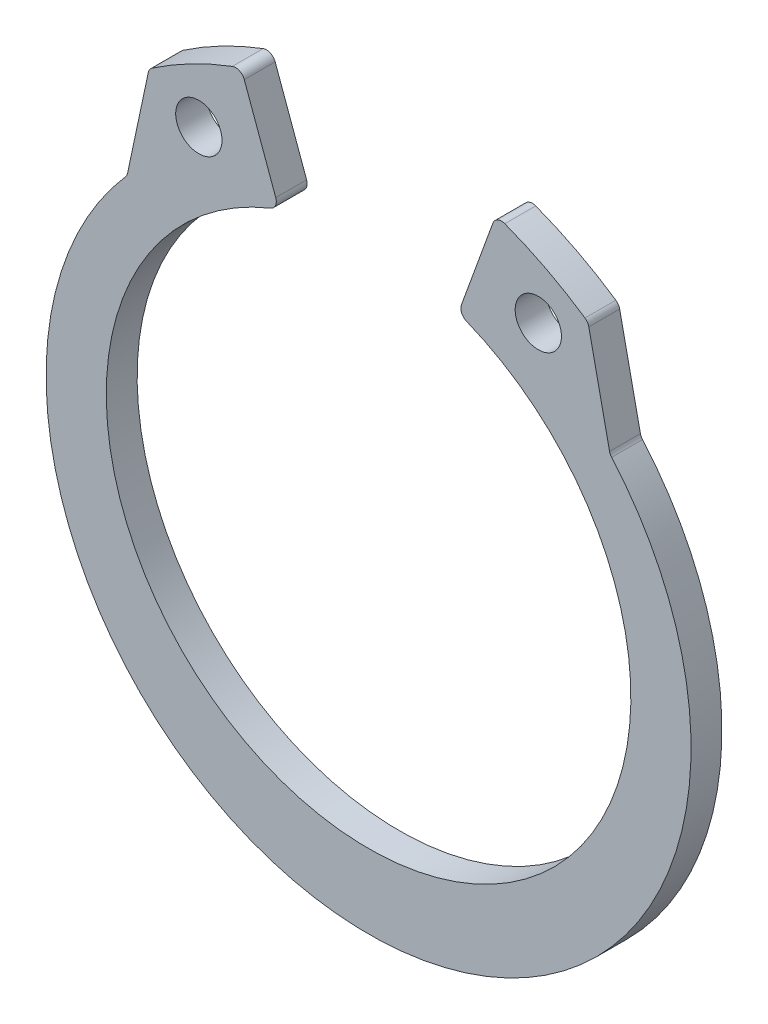
ISO-10303-21;
HEADER;
FILE_DESCRIPTION(('STEP AP214'),'2;1');
FILE_NAME('part.step','',(''),(''),'','','');
FILE_SCHEMA(('AUTOMOTIVE_DESIGN { 1 0 10303 214 1 1 1 1 }'));
ENDSEC;
DATA;
#1=APPLICATION_CONTEXT('core data for automotive mechanical design processes');
#2=APPLICATION_PROTOCOL_DEFINITION('international standard','automotive_design',2000,#1);
#3=PRODUCT_CONTEXT('',#1,'mechanical');
#4=PRODUCT('Part','Part','',(#3));
#5=PRODUCT_RELATED_PRODUCT_CATEGORY('part','',(#4));
#6=PRODUCT_DEFINITION_FORMATION('','',#4);
#7=PRODUCT_DEFINITION_CONTEXT('part definition',#1,'design');
#8=PRODUCT_DEFINITION('design','',#6,#7);
#9=PRODUCT_DEFINITION_SHAPE('','',#8);
#10=(LENGTH_UNIT() NAMED_UNIT(*) SI_UNIT(.MILLI.,.METRE.));
#11=(NAMED_UNIT(*) PLANE_ANGLE_UNIT() SI_UNIT($,.RADIAN.));
#12=(NAMED_UNIT(*) SI_UNIT($,.STERADIAN.) SOLID_ANGLE_UNIT());
#13=UNCERTAINTY_MEASURE_WITH_UNIT(LENGTH_MEASURE(1.E-05),#10,'distance_accuracy_value','');
#14=(GEOMETRIC_REPRESENTATION_CONTEXT(3) GLOBAL_UNCERTAINTY_ASSIGNED_CONTEXT((#13)) GLOBAL_UNIT_ASSIGNED_CONTEXT((#10,
#11,#12)) REPRESENTATION_CONTEXT('',''));
#15=CARTESIAN_POINT('',(0.,0.,0.));
#16=DIRECTION('',(0.,0.,1.));
#17=DIRECTION('',(1.,0.,0.));
#18=AXIS2_PLACEMENT_3D('',#15,#16,#17);
#19=CARTESIAN_POINT('',(-4.30962714854673,10.9634619568521,1.));
#20=DIRECTION('',(0.,0.,1.));
#21=DIRECTION('',(1.,0.,0.));
#22=AXIS2_PLACEMENT_3D('',#19,#20,#21);
#23=PLANE('',#22);
#24=CARTESIAN_POINT('',(-5.5,9.,1.));
#25=DIRECTION('',(0.,0.,1.));
#26=DIRECTION('',(1.,0.,0.));
#27=AXIS2_PLACEMENT_3D('',#24,#25,#26);
#28=CIRCLE('',#27,0.750000000000001);
#29=CARTESIAN_POINT('',(-4.75,9.,1.));
#30=VERTEX_POINT('',#29);
#31=EDGE_CURVE('E482',#30,#30,#28,.T.);
#32=ORIENTED_EDGE('',*,*,#31,.F.);
#33=EDGE_LOOP('',(#32));
#34=FACE_BOUND('',#33,.T.);
#35=CARTESIAN_POINT('',(-4.30962714854673,10.9634619568521,1.));
#36=DIRECTION('',(0.,0.,1.));
#37=DIRECTION('',(1.,0.,0.));
#38=AXIS2_PLACEMENT_3D('',#35,#36,#37);
#39=CIRCLE('',#38,0.300000000000001);
#40=CARTESIAN_POINT('',(-4.02771936231096,11.0660679998497,1.));
#41=VERTEX_POINT('',#40);
#42=CARTESIAN_POINT('',(-4.41560158662575,11.2441208574304,1.));
#43=VERTEX_POINT('',#42);
#44=EDGE_CURVE('E516',#41,#43,#39,.T.);
#45=ORIENTED_EDGE('',*,*,#44,.T.);
#46=CARTESIAN_POINT('',(0.,-0.45,1.));
#47=DIRECTION('',(0.,0.,1.));
#48=DIRECTION('',(1.,0.,0.));
#49=AXIS2_PLACEMENT_3D('',#46,#47,#48);
#50=CIRCLE('',#49,12.5);
#51=CARTESIAN_POINT('',(-7.01270309923166,9.89755986897523,1.));
#52=VERTEX_POINT('',#51);
#53=EDGE_CURVE('E477',#43,#52,#50,.T.);
#54=ORIENTED_EDGE('',*,*,#53,.T.);
#55=CARTESIAN_POINT('',(-6.8443982248501,9.64921843211983,1.));
#56=DIRECTION('',(0.,0.,1.));
#57=DIRECTION('',(1.,0.,0.));
#58=AXIS2_PLACEMENT_3D('',#55,#56,#57);
#59=CIRCLE('',#58,0.299999999999999);
#60=CARTESIAN_POINT('',(-7.13784250507024,9.71159193936516,1.));
#61=VERTEX_POINT('',#60);
#62=EDGE_CURVE('E519',#52,#61,#59,.T.);
#63=ORIENTED_EDGE('',*,*,#62,.T.);
#64=DIRECTION('',(-0.207911690817759,-0.978147600733806,0.));
#65=VECTOR('',#64,1.);
#66=CARTESIAN_POINT('',(-7.80942490766801,6.55204514710783,1.));
#67=LINE('',#66,#65);
#68=CARTESIAN_POINT('',(-7.80942490766801,6.55204514710783,1.));
#69=VERTEX_POINT('',#68);
#70=EDGE_CURVE('E521',#61,#69,#67,.T.);
#71=ORIENTED_EDGE('',*,*,#70,.T.);
#72=CARTESIAN_POINT('',(-8.10286918788815,6.61441865435316,1.));
#73=DIRECTION('',(0.,0.,-1.));
#74=DIRECTION('',(-1.,0.,0.));
#75=AXIS2_PLACEMENT_3D('',#72,#73,#74);
#76=CIRCLE('',#75,0.3);
#77=CARTESIAN_POINT('',(-7.87674260590057,6.41727208725493,1.));
#78=VERTEX_POINT('',#77);
#79=EDGE_CURVE('E523',#69,#78,#76,.T.);
#80=ORIENTED_EDGE('',*,*,#79,.T.);
#81=CARTESIAN_POINT('',(0.,-0.45,1.));
#82=DIRECTION('',(0.,0.,1.));
#83=DIRECTION('',(1.,0.,0.));
#84=AXIS2_PLACEMENT_3D('',#81,#82,#83);
#85=CIRCLE('',#84,10.45);
#86=CARTESIAN_POINT('',(7.87674260590057,6.41727208725493,1.));
#87=VERTEX_POINT('',#86);
#88=EDGE_CURVE('E525',#78,#87,#85,.T.);
#89=ORIENTED_EDGE('',*,*,#88,.T.);
#90=CARTESIAN_POINT('',(8.10286918788815,6.61441865435316,1.));
#91=DIRECTION('',(0.,0.,-1.));
#92=DIRECTION('',(1.,0.,0.));
#93=AXIS2_PLACEMENT_3D('',#90,#91,#92);
#94=CIRCLE('',#93,0.3);
#95=CARTESIAN_POINT('',(7.80942490766801,6.55204514710783,1.));
#96=VERTEX_POINT('',#95);
#97=EDGE_CURVE('E527',#87,#96,#94,.T.);
#98=ORIENTED_EDGE('',*,*,#97,.T.);
#99=DIRECTION('',(-0.207911690817759,0.978147600733806,0.));
#100=VECTOR('',#99,1.);
#101=CARTESIAN_POINT('',(7.80942490766801,6.55204514710783,1.));
#102=LINE('',#101,#100);
#103=CARTESIAN_POINT('',(7.13784250507024,9.71159193936516,1.));
#104=VERTEX_POINT('',#103);
#105=EDGE_CURVE('E529',#96,#104,#102,.T.);
#106=ORIENTED_EDGE('',*,*,#105,.T.);
#107=CARTESIAN_POINT('',(6.8443982248501,9.64921843211983,1.));
#108=DIRECTION('',(0.,0.,1.));
#109=DIRECTION('',(-1.,0.,0.));
#110=AXIS2_PLACEMENT_3D('',#107,#108,#109);
#111=CIRCLE('',#110,0.299999999999999);
#112=CARTESIAN_POINT('',(7.01270309923166,9.89755986897523,1.));
#113=VERTEX_POINT('',#112);
#114=EDGE_CURVE('E531',#104,#113,#111,.T.);
#115=ORIENTED_EDGE('',*,*,#114,.T.);
#116=CARTESIAN_POINT('',(0.,-0.45,1.));
#117=DIRECTION('',(0.,0.,1.));
#118=DIRECTION('',(-1.,0.,0.));
#119=AXIS2_PLACEMENT_3D('',#116,#117,#118);
#120=CIRCLE('',#119,12.5);
#121=CARTESIAN_POINT('',(4.41560158662575,11.2441208574304,1.));
#122=VERTEX_POINT('',#121);
#123=EDGE_CURVE('E533',#113,#122,#120,.T.);
#124=ORIENTED_EDGE('',*,*,#123,.T.);
#125=CARTESIAN_POINT('',(4.30962714854673,10.9634619568521,1.));
#126=DIRECTION('',(0.,0.,1.));
#127=DIRECTION('',(-1.,0.,0.));
#128=AXIS2_PLACEMENT_3D('',#125,#126,#127);
#129=CIRCLE('',#128,0.300000000000001);
#130=CARTESIAN_POINT('',(4.02771936231096,11.0660679998497,1.));
#131=VERTEX_POINT('',#130);
#132=EDGE_CURVE('E535',#122,#131,#129,.T.);
#133=ORIENTED_EDGE('',*,*,#132,.T.);
#134=DIRECTION('',(-0.34202014332566,-0.939692620785911,0.));
#135=VECTOR('',#134,1.);
#136=CARTESIAN_POINT('',(4.02771936231096,11.0660679998497,1.));
#137=LINE('',#136,#135);
#138=CARTESIAN_POINT('',(3.00802778617041,8.26448841959542,1.));
#139=VERTEX_POINT('',#138);
#140=EDGE_CURVE('E537',#131,#139,#137,.T.);
#141=ORIENTED_EDGE('',*,*,#140,.T.);
#142=CARTESIAN_POINT('',(3.28993557240618,8.16188237659772,1.));
#143=DIRECTION('',(0.,0.,1.));
#144=DIRECTION('',(1.,0.,0.));
#145=AXIS2_PLACEMENT_3D('',#142,#143,#144);
#146=CIRCLE('',#145,0.3);
#147=CARTESIAN_POINT('',(3.17777867789233,7.88363638648643,1.));
#148=VERTEX_POINT('',#147);
#149=EDGE_CURVE('E539',#139,#148,#146,.T.);
#150=ORIENTED_EDGE('',*,*,#149,.T.);
#151=CARTESIAN_POINT('',(0.,0.,1.));
#152=DIRECTION('',(0.,0.,-1.));
#153=DIRECTION('',(1.,0.,0.));
#154=AXIS2_PLACEMENT_3D('',#151,#152,#153);
#155=CIRCLE('',#154,8.5);
#156=CARTESIAN_POINT('',(-3.17777867789233,7.88363638648643,1.));
#157=VERTEX_POINT('',#156);
#158=EDGE_CURVE('E541',#148,#157,#155,.T.);
#159=ORIENTED_EDGE('',*,*,#158,.T.);
#160=CARTESIAN_POINT('',(-3.28993557240618,8.16188237659772,1.));
#161=DIRECTION('',(0.,0.,1.));
#162=DIRECTION('',(-1.,0.,0.));
#163=AXIS2_PLACEMENT_3D('',#160,#161,#162);
#164=CIRCLE('',#163,0.300000000000003);
#165=CARTESIAN_POINT('',(-3.0080277861704,8.26448841959542,1.));
#166=VERTEX_POINT('',#165);
#167=EDGE_CURVE('E370',#157,#166,#164,.T.);
#168=ORIENTED_EDGE('',*,*,#167,.T.);
#169=DIRECTION('',(-0.342020143325662,0.939692620785911,0.));
#170=VECTOR('',#169,1.);
#171=CARTESIAN_POINT('',(-4.02771936231096,11.0660679998497,1.));
#172=LINE('',#171,#170);
#173=EDGE_CURVE('E365',#166,#41,#172,.T.);
#174=ORIENTED_EDGE('',*,*,#173,.T.);
#175=EDGE_LOOP('',(#45,#54,#63,#71,#80,#89,#98,#106,#115,#124,#133,#141,#150,#159,#168,#174));
#176=FACE_BOUND('',#175,.T.);
#177=CARTESIAN_POINT('',(5.5,9.,1.));
#178=DIRECTION('',(0.,0.,1.));
#179=DIRECTION('',(-1.,0.,0.));
#180=AXIS2_PLACEMENT_3D('',#177,#178,#179);
#181=CIRCLE('',#180,0.750000000000001);
#182=CARTESIAN_POINT('',(4.75,9.,1.));
#183=VERTEX_POINT('',#182);
#184=EDGE_CURVE('E676',#183,#183,#181,.T.);
#185=ORIENTED_EDGE('',*,*,#184,.F.);
#186=EDGE_LOOP('',(#185));
#187=FACE_BOUND('',#186,.T.);
#188=ADVANCED_FACE('F350',(#34,#176,#187),#23,.T.);
#189=CARTESIAN_POINT('',(-4.30962714854673,10.9634619568521,0.));
#190=DIRECTION('',(0.,0.,1.));
#191=DIRECTION('',(1.,0.,0.));
#192=AXIS2_PLACEMENT_3D('',#189,#190,#191);
#193=PLANE('',#192);
#194=CARTESIAN_POINT('',(-5.5,9.,0.));
#195=DIRECTION('',(0.,0.,1.));
#196=DIRECTION('',(1.,0.,0.));
#197=AXIS2_PLACEMENT_3D('',#194,#195,#196);
#198=CIRCLE('',#197,0.750000000000001);
#199=CARTESIAN_POINT('',(-4.75,9.,0.));
#200=VERTEX_POINT('',#199);
#201=EDGE_CURVE('E485',#200,#200,#198,.T.);
#202=ORIENTED_EDGE('',*,*,#201,.T.);
#203=EDGE_LOOP('',(#202));
#204=FACE_BOUND('',#203,.T.);
#205=CARTESIAN_POINT('',(-4.30962714854673,10.9634619568521,0.));
#206=DIRECTION('',(0.,0.,1.));
#207=DIRECTION('',(1.,0.,0.));
#208=AXIS2_PLACEMENT_3D('',#205,#206,#207);
#209=CIRCLE('',#208,0.300000000000001);
#210=CARTESIAN_POINT('',(-4.02771936231096,11.0660679998497,0.));
#211=VERTEX_POINT('',#210);
#212=CARTESIAN_POINT('',(-4.41560158662575,11.2441208574304,0.));
#213=VERTEX_POINT('',#212);
#214=EDGE_CURVE('E468',#211,#213,#209,.T.);
#215=ORIENTED_EDGE('',*,*,#214,.F.);
#216=DIRECTION('',(-0.342020143325662,0.939692620785911,0.));
#217=VECTOR('',#216,1.);
#218=CARTESIAN_POINT('',(-4.02771936231096,11.0660679998497,0.));
#219=LINE('',#218,#217);
#220=CARTESIAN_POINT('',(-3.0080277861704,8.26448841959542,0.));
#221=VERTEX_POINT('',#220);
#222=EDGE_CURVE('E514',#221,#211,#219,.T.);
#223=ORIENTED_EDGE('',*,*,#222,.F.);
#224=CARTESIAN_POINT('',(-3.28993557240618,8.16188237659772,0.));
#225=DIRECTION('',(0.,0.,1.));
#226=DIRECTION('',(-1.,0.,0.));
#227=AXIS2_PLACEMENT_3D('',#224,#225,#226);
#228=CIRCLE('',#227,0.300000000000003);
#229=CARTESIAN_POINT('',(-3.17777867789233,7.88363638648643,0.));
#230=VERTEX_POINT('',#229);
#231=EDGE_CURVE('E512',#230,#221,#228,.T.);
#232=ORIENTED_EDGE('',*,*,#231,.F.);
#233=CARTESIAN_POINT('',(0.,0.,0.));
#234=DIRECTION('',(0.,0.,-1.));
#235=DIRECTION('',(1.,0.,0.));
#236=AXIS2_PLACEMENT_3D('',#233,#234,#235);
#237=CIRCLE('',#236,8.5);
#238=CARTESIAN_POINT('',(3.17777867789233,7.88363638648643,0.));
#239=VERTEX_POINT('',#238);
#240=EDGE_CURVE('E510',#239,#230,#237,.T.);
#241=ORIENTED_EDGE('',*,*,#240,.F.);
#242=CARTESIAN_POINT('',(3.28993557240618,8.16188237659772,0.));
#243=DIRECTION('',(0.,0.,1.));
#244=DIRECTION('',(1.,0.,0.));
#245=AXIS2_PLACEMENT_3D('',#242,#243,#244);
#246=CIRCLE('',#245,0.3);
#247=CARTESIAN_POINT('',(3.00802778617041,8.26448841959542,0.));
#248=VERTEX_POINT('',#247);
#249=EDGE_CURVE('E508',#248,#239,#246,.T.);
#250=ORIENTED_EDGE('',*,*,#249,.F.);
#251=DIRECTION('',(-0.34202014332566,-0.939692620785911,0.));
#252=VECTOR('',#251,1.);
#253=CARTESIAN_POINT('',(4.02771936231096,11.0660679998497,0.));
#254=LINE('',#253,#252);
#255=CARTESIAN_POINT('',(4.02771936231096,11.0660679998497,0.));
#256=VERTEX_POINT('',#255);
#257=EDGE_CURVE('E506',#256,#248,#254,.T.);
#258=ORIENTED_EDGE('',*,*,#257,.F.);
#259=CARTESIAN_POINT('',(4.30962714854673,10.9634619568521,0.));
#260=DIRECTION('',(0.,0.,1.));
#261=DIRECTION('',(-1.,0.,0.));
#262=AXIS2_PLACEMENT_3D('',#259,#260,#261);
#263=CIRCLE('',#262,0.300000000000001);
#264=CARTESIAN_POINT('',(4.41560158662575,11.2441208574304,0.));
#265=VERTEX_POINT('',#264);
#266=EDGE_CURVE('E504',#265,#256,#263,.T.);
#267=ORIENTED_EDGE('',*,*,#266,.F.);
#268=CARTESIAN_POINT('',(0.,-0.45,0.));
#269=DIRECTION('',(0.,0.,1.));
#270=DIRECTION('',(-1.,0.,0.));
#271=AXIS2_PLACEMENT_3D('',#268,#269,#270);
#272=CIRCLE('',#271,12.5);
#273=CARTESIAN_POINT('',(7.01270309923166,9.89755986897523,0.));
#274=VERTEX_POINT('',#273);
#275=EDGE_CURVE('E502',#274,#265,#272,.T.);
#276=ORIENTED_EDGE('',*,*,#275,.F.);
#277=CARTESIAN_POINT('',(6.8443982248501,9.64921843211983,0.));
#278=DIRECTION('',(0.,0.,1.));
#279=DIRECTION('',(-1.,0.,0.));
#280=AXIS2_PLACEMENT_3D('',#277,#278,#279);
#281=CIRCLE('',#280,0.299999999999999);
#282=CARTESIAN_POINT('',(7.13784250507024,9.71159193936516,0.));
#283=VERTEX_POINT('',#282);
#284=EDGE_CURVE('E500',#283,#274,#281,.T.);
#285=ORIENTED_EDGE('',*,*,#284,.F.);
#286=DIRECTION('',(-0.207911690817759,0.978147600733806,0.));
#287=VECTOR('',#286,1.);
#288=CARTESIAN_POINT('',(7.80942490766801,6.55204514710783,0.));
#289=LINE('',#288,#287);
#290=CARTESIAN_POINT('',(7.80942490766801,6.55204514710783,0.));
#291=VERTEX_POINT('',#290);
#292=EDGE_CURVE('E498',#291,#283,#289,.T.);
#293=ORIENTED_EDGE('',*,*,#292,.F.);
#294=CARTESIAN_POINT('',(8.10286918788815,6.61441865435316,0.));
#295=DIRECTION('',(0.,0.,-1.));
#296=DIRECTION('',(1.,0.,0.));
#297=AXIS2_PLACEMENT_3D('',#294,#295,#296);
#298=CIRCLE('',#297,0.3);
#299=CARTESIAN_POINT('',(7.87674260590057,6.41727208725493,0.));
#300=VERTEX_POINT('',#299);
#301=EDGE_CURVE('E496',#300,#291,#298,.T.);
#302=ORIENTED_EDGE('',*,*,#301,.F.);
#303=CARTESIAN_POINT('',(0.,-0.45,0.));
#304=DIRECTION('',(0.,0.,1.));
#305=DIRECTION('',(1.,0.,0.));
#306=AXIS2_PLACEMENT_3D('',#303,#304,#305);
#307=CIRCLE('',#306,10.45);
#308=CARTESIAN_POINT('',(-7.87674260590057,6.41727208725493,0.));
#309=VERTEX_POINT('',#308);
#310=EDGE_CURVE('E494',#309,#300,#307,.T.);
#311=ORIENTED_EDGE('',*,*,#310,.F.);
#312=CARTESIAN_POINT('',(-8.10286918788815,6.61441865435316,0.));
#313=DIRECTION('',(0.,0.,-1.));
#314=DIRECTION('',(-1.,0.,0.));
#315=AXIS2_PLACEMENT_3D('',#312,#313,#314);
#316=CIRCLE('',#315,0.3);
#317=CARTESIAN_POINT('',(-7.80942490766801,6.55204514710783,0.));
#318=VERTEX_POINT('',#317);
#319=EDGE_CURVE('E492',#318,#309,#316,.T.);
#320=ORIENTED_EDGE('',*,*,#319,.F.);
#321=DIRECTION('',(-0.207911690817759,-0.978147600733806,0.));
#322=VECTOR('',#321,1.);
#323=CARTESIAN_POINT('',(-7.80942490766801,6.55204514710783,0.));
#324=LINE('',#323,#322);
#325=CARTESIAN_POINT('',(-7.13784250507024,9.71159193936516,0.));
#326=VERTEX_POINT('',#325);
#327=EDGE_CURVE('E490',#326,#318,#324,.T.);
#328=ORIENTED_EDGE('',*,*,#327,.F.);
#329=CARTESIAN_POINT('',(-6.8443982248501,9.64921843211983,0.));
#330=DIRECTION('',(0.,0.,1.));
#331=DIRECTION('',(1.,0.,0.));
#332=AXIS2_PLACEMENT_3D('',#329,#330,#331);
#333=CIRCLE('',#332,0.299999999999999);
#334=CARTESIAN_POINT('',(-7.01270309923166,9.89755986897523,0.));
#335=VERTEX_POINT('',#334);
#336=EDGE_CURVE('E470',#335,#326,#333,.T.);
#337=ORIENTED_EDGE('',*,*,#336,.F.);
#338=CARTESIAN_POINT('',(0.,-0.45,0.));
#339=DIRECTION('',(0.,0.,1.));
#340=DIRECTION('',(1.,0.,0.));
#341=AXIS2_PLACEMENT_3D('',#338,#339,#340);
#342=CIRCLE('',#341,12.5);
#343=EDGE_CURVE('E463',#213,#335,#342,.T.);
#344=ORIENTED_EDGE('',*,*,#343,.F.);
#345=EDGE_LOOP('',(#215,#223,#232,#241,#250,#258,#267,#276,#285,#293,#302,#311,#320,#328,#337,#344));
#346=FACE_BOUND('',#345,.T.);
#347=CARTESIAN_POINT('',(5.5,9.,0.));
#348=DIRECTION('',(0.,0.,1.));
#349=DIRECTION('',(-1.,0.,0.));
#350=AXIS2_PLACEMENT_3D('',#347,#348,#349);
#351=CIRCLE('',#350,0.750000000000001);
#352=CARTESIAN_POINT('',(4.75,9.,0.));
#353=VERTEX_POINT('',#352);
#354=EDGE_CURVE('E679',#353,#353,#351,.T.);
#355=ORIENTED_EDGE('',*,*,#354,.T.);
#356=EDGE_LOOP('',(#355));
#357=FACE_BOUND('',#356,.T.);
#358=ADVANCED_FACE('F464',(#204,#346,#357),#193,.F.);
#359=CARTESIAN_POINT('',(-4.30962714854673,10.9634619568521,1.));
#360=DIRECTION('',(0.,0.,-1.));
#361=DIRECTION('',(-1.,0.,0.));
#362=AXIS2_PLACEMENT_3D('',#359,#360,#361);
#363=CYLINDRICAL_SURFACE('',#362,0.300000000000001);
#364=ORIENTED_EDGE('',*,*,#214,.T.);
#365=DIRECTION('',(0.,0.,-1.));
#366=VECTOR('',#365,1.);
#367=CARTESIAN_POINT('',(-4.41560158662575,11.2441208574304,1.));
#368=LINE('',#367,#366);
#369=EDGE_CURVE('E11',#43,#213,#368,.T.);
#370=ORIENTED_EDGE('',*,*,#369,.F.);
#371=ORIENTED_EDGE('',*,*,#44,.F.);
#372=DIRECTION('',(0.,0.,-1.));
#373=VECTOR('',#372,1.);
#374=CARTESIAN_POINT('',(-4.02771936231096,11.0660679998497,1.));
#375=LINE('',#374,#373);
#376=EDGE_CURVE('E481',#41,#211,#375,.T.);
#377=ORIENTED_EDGE('',*,*,#376,.T.);
#378=EDGE_LOOP('',(#364,#370,#371,#377));
#379=FACE_BOUND('',#378,.T.);
#380=ADVANCED_FACE('F352',(#379),#363,.T.);
#381=CARTESIAN_POINT('',(0.,-0.45,1.));
#382=DIRECTION('',(0.,0.,-1.));
#383=DIRECTION('',(-1.,0.,0.));
#384=AXIS2_PLACEMENT_3D('',#381,#382,#383);
#385=CYLINDRICAL_SURFACE('',#384,12.5);
#386=ORIENTED_EDGE('',*,*,#343,.T.);
#387=DIRECTION('',(0.,0.,-1.));
#388=VECTOR('',#387,1.);
#389=CARTESIAN_POINT('',(-7.01270309923166,9.89755986897523,1.));
#390=LINE('',#389,#388);
#391=EDGE_CURVE('E358',#52,#335,#390,.T.);
#392=ORIENTED_EDGE('',*,*,#391,.F.);
#393=ORIENTED_EDGE('',*,*,#53,.F.);
#394=ORIENTED_EDGE('',*,*,#369,.T.);
#395=EDGE_LOOP('',(#386,#392,#393,#394));
#396=FACE_BOUND('',#395,.T.);
#397=ADVANCED_FACE('F476',(#396),#385,.T.);
#398=CARTESIAN_POINT('',(-6.8443982248501,9.64921843211983,1.));
#399=DIRECTION('',(0.,0.,-1.));
#400=DIRECTION('',(-1.,0.,0.));
#401=AXIS2_PLACEMENT_3D('',#398,#399,#400);
#402=CYLINDRICAL_SURFACE('',#401,0.299999999999999);
#403=ORIENTED_EDGE('',*,*,#336,.T.);
#404=DIRECTION('',(0.,0.,-1.));
#405=VECTOR('',#404,1.);
#406=CARTESIAN_POINT('',(-7.13784250507024,9.71159193936516,1.));
#407=LINE('',#406,#405);
#408=EDGE_CURVE('E582',#61,#326,#407,.T.);
#409=ORIENTED_EDGE('',*,*,#408,.F.);
#410=ORIENTED_EDGE('',*,*,#62,.F.);
#411=ORIENTED_EDGE('',*,*,#391,.T.);
#412=EDGE_LOOP('',(#403,#409,#410,#411));
#413=FACE_BOUND('',#412,.T.);
#414=ADVANCED_FACE('F586',(#413),#402,.T.);
#415=CARTESIAN_POINT('',(-7.80942490766801,6.55204514710783,1.));
#416=DIRECTION('',(0.978147600733806,-0.207911690817759,0.));
#417=DIRECTION('',(0.207911690817759,0.978147600733806,0.));
#418=AXIS2_PLACEMENT_3D('',#415,#416,#417);
#419=PLANE('',#418);
#420=ORIENTED_EDGE('',*,*,#327,.T.);
#421=DIRECTION('',(0.,0.,-1.));
#422=VECTOR('',#421,1.);
#423=CARTESIAN_POINT('',(-7.80942490766801,6.55204514710783,1.));
#424=LINE('',#423,#422);
#425=EDGE_CURVE('E579',#69,#318,#424,.T.);
#426=ORIENTED_EDGE('',*,*,#425,.F.);
#427=ORIENTED_EDGE('',*,*,#70,.F.);
#428=ORIENTED_EDGE('',*,*,#408,.T.);
#429=EDGE_LOOP('',(#420,#426,#427,#428));
#430=FACE_BOUND('',#429,.T.);
#431=ADVANCED_FACE('F594',(#430),#419,.F.);
#432=CARTESIAN_POINT('',(-8.10286918788815,6.61441865435316,1.));
#433=DIRECTION('',(0.,0.,-1.));
#434=DIRECTION('',(-1.,0.,0.));
#435=AXIS2_PLACEMENT_3D('',#432,#433,#434);
#436=CYLINDRICAL_SURFACE('',#435,0.3);
#437=ORIENTED_EDGE('',*,*,#319,.T.);
#438=DIRECTION('',(0.,0.,-1.));
#439=VECTOR('',#438,1.);
#440=CARTESIAN_POINT('',(-7.87674260590057,6.41727208725493,1.));
#441=LINE('',#440,#439);
#442=EDGE_CURVE('E576',#78,#309,#441,.T.);
#443=ORIENTED_EDGE('',*,*,#442,.F.);
#444=ORIENTED_EDGE('',*,*,#79,.F.);
#445=ORIENTED_EDGE('',*,*,#425,.T.);
#446=EDGE_LOOP('',(#437,#443,#444,#445));
#447=FACE_BOUND('',#446,.T.);
#448=ADVANCED_FACE('F597',(#447),#436,.F.);
#449=CARTESIAN_POINT('',(0.,-0.45,1.));
#450=DIRECTION('',(0.,0.,-1.));
#451=DIRECTION('',(-1.,0.,0.));
#452=AXIS2_PLACEMENT_3D('',#449,#450,#451);
#453=CYLINDRICAL_SURFACE('',#452,10.45);
#454=ORIENTED_EDGE('',*,*,#310,.T.);
#455=DIRECTION('',(0.,0.,-1.));
#456=VECTOR('',#455,1.);
#457=CARTESIAN_POINT('',(7.87674260590057,6.41727208725493,1.));
#458=LINE('',#457,#456);
#459=EDGE_CURVE('E573',#87,#300,#458,.T.);
#460=ORIENTED_EDGE('',*,*,#459,.F.);
#461=ORIENTED_EDGE('',*,*,#88,.F.);
#462=ORIENTED_EDGE('',*,*,#442,.T.);
#463=EDGE_LOOP('',(#454,#460,#461,#462));
#464=FACE_BOUND('',#463,.T.);
#465=ADVANCED_FACE('F602',(#464),#453,.T.);
#466=CARTESIAN_POINT('',(8.10286918788815,6.61441865435316,1.));
#467=DIRECTION('',(0.,0.,-1.));
#468=DIRECTION('',(-1.,0.,0.));
#469=AXIS2_PLACEMENT_3D('',#466,#467,#468);
#470=CYLINDRICAL_SURFACE('',#469,0.3);
#471=ORIENTED_EDGE('',*,*,#301,.T.);
#472=DIRECTION('',(0.,0.,-1.));
#473=VECTOR('',#472,1.);
#474=CARTESIAN_POINT('',(7.80942490766801,6.55204514710783,1.));
#475=LINE('',#474,#473);
#476=EDGE_CURVE('E570',#96,#291,#475,.T.);
#477=ORIENTED_EDGE('',*,*,#476,.F.);
#478=ORIENTED_EDGE('',*,*,#97,.F.);
#479=ORIENTED_EDGE('',*,*,#459,.T.);
#480=EDGE_LOOP('',(#471,#477,#478,#479));
#481=FACE_BOUND('',#480,.T.);
#482=ADVANCED_FACE('F608',(#481),#470,.F.);
#483=CARTESIAN_POINT('',(7.80942490766801,6.55204514710783,1.));
#484=DIRECTION('',(-0.978147600733806,-0.207911690817759,0.));
#485=DIRECTION('',(0.207911690817759,-0.978147600733806,0.));
#486=AXIS2_PLACEMENT_3D('',#483,#484,#485);
#487=PLANE('',#486);
#488=ORIENTED_EDGE('',*,*,#292,.T.);
#489=DIRECTION('',(0.,0.,-1.));
#490=VECTOR('',#489,1.);
#491=CARTESIAN_POINT('',(7.13784250507024,9.71159193936516,1.));
#492=LINE('',#491,#490);
#493=EDGE_CURVE('E567',#104,#283,#492,.T.);
#494=ORIENTED_EDGE('',*,*,#493,.F.);
#495=ORIENTED_EDGE('',*,*,#105,.F.);
#496=ORIENTED_EDGE('',*,*,#476,.T.);
#497=EDGE_LOOP('',(#488,#494,#495,#496));
#498=FACE_BOUND('',#497,.T.);
#499=ADVANCED_FACE('F612',(#498),#487,.F.);
#500=CARTESIAN_POINT('',(6.8443982248501,9.64921843211983,1.));
#501=DIRECTION('',(0.,0.,-1.));
#502=DIRECTION('',(-1.,0.,0.));
#503=AXIS2_PLACEMENT_3D('',#500,#501,#502);
#504=CYLINDRICAL_SURFACE('',#503,0.299999999999999);
#505=ORIENTED_EDGE('',*,*,#284,.T.);
#506=DIRECTION('',(0.,0.,-1.));
#507=VECTOR('',#506,1.);
#508=CARTESIAN_POINT('',(7.01270309923166,9.89755986897523,1.));
#509=LINE('',#508,#507);
#510=EDGE_CURVE('E564',#113,#274,#509,.T.);
#511=ORIENTED_EDGE('',*,*,#510,.F.);
#512=ORIENTED_EDGE('',*,*,#114,.F.);
#513=ORIENTED_EDGE('',*,*,#493,.T.);
#514=EDGE_LOOP('',(#505,#511,#512,#513));
#515=FACE_BOUND('',#514,.T.);
#516=ADVANCED_FACE('F617',(#515),#504,.T.);
#517=CARTESIAN_POINT('',(0.,-0.45,1.));
#518=DIRECTION('',(0.,0.,-1.));
#519=DIRECTION('',(-1.,0.,0.));
#520=AXIS2_PLACEMENT_3D('',#517,#518,#519);
#521=CYLINDRICAL_SURFACE('',#520,12.5);
#522=ORIENTED_EDGE('',*,*,#275,.T.);
#523=DIRECTION('',(0.,0.,-1.));
#524=VECTOR('',#523,1.);
#525=CARTESIAN_POINT('',(4.41560158662575,11.2441208574304,1.));
#526=LINE('',#525,#524);
#527=EDGE_CURVE('E561',#122,#265,#526,.T.);
#528=ORIENTED_EDGE('',*,*,#527,.F.);
#529=ORIENTED_EDGE('',*,*,#123,.F.);
#530=ORIENTED_EDGE('',*,*,#510,.T.);
#531=EDGE_LOOP('',(#522,#528,#529,#530));
#532=FACE_BOUND('',#531,.T.);
#533=ADVANCED_FACE('F623',(#532),#521,.T.);
#534=CARTESIAN_POINT('',(4.30962714854673,10.9634619568521,1.));
#535=DIRECTION('',(0.,0.,-1.));
#536=DIRECTION('',(-1.,0.,0.));
#537=AXIS2_PLACEMENT_3D('',#534,#535,#536);
#538=CYLINDRICAL_SURFACE('',#537,0.300000000000001);
#539=ORIENTED_EDGE('',*,*,#266,.T.);
#540=DIRECTION('',(0.,0.,-1.));
#541=VECTOR('',#540,1.);
#542=CARTESIAN_POINT('',(4.02771936231096,11.0660679998497,1.));
#543=LINE('',#542,#541);
#544=EDGE_CURVE('E558',#131,#256,#543,.T.);
#545=ORIENTED_EDGE('',*,*,#544,.F.);
#546=ORIENTED_EDGE('',*,*,#132,.F.);
#547=ORIENTED_EDGE('',*,*,#527,.T.);
#548=EDGE_LOOP('',(#539,#545,#546,#547));
#549=FACE_BOUND('',#548,.T.);
#550=ADVANCED_FACE('F627',(#549),#538,.T.);
#551=CARTESIAN_POINT('',(4.02771936231096,11.0660679998497,1.));
#552=DIRECTION('',(0.939692620785911,-0.34202014332566,0.));
#553=DIRECTION('',(0.34202014332566,0.939692620785911,0.));
#554=AXIS2_PLACEMENT_3D('',#551,#552,#553);
#555=PLANE('',#554);
#556=ORIENTED_EDGE('',*,*,#257,.T.);
#557=DIRECTION('',(0.,0.,-1.));
#558=VECTOR('',#557,1.);
#559=CARTESIAN_POINT('',(3.00802778617041,8.26448841959542,1.));
#560=LINE('',#559,#558);
#561=EDGE_CURVE('E555',#139,#248,#560,.T.);
#562=ORIENTED_EDGE('',*,*,#561,.F.);
#563=ORIENTED_EDGE('',*,*,#140,.F.);
#564=ORIENTED_EDGE('',*,*,#544,.T.);
#565=EDGE_LOOP('',(#556,#562,#563,#564));
#566=FACE_BOUND('',#565,.T.);
#567=ADVANCED_FACE('F632',(#566),#555,.F.);
#568=CARTESIAN_POINT('',(3.28993557240618,8.16188237659772,1.));
#569=DIRECTION('',(0.,0.,-1.));
#570=DIRECTION('',(-1.,0.,0.));
#571=AXIS2_PLACEMENT_3D('',#568,#569,#570);
#572=CYLINDRICAL_SURFACE('',#571,0.3);
#573=ORIENTED_EDGE('',*,*,#249,.T.);
#574=DIRECTION('',(0.,0.,-1.));
#575=VECTOR('',#574,1.);
#576=CARTESIAN_POINT('',(3.17777867789233,7.88363638648643,1.));
#577=LINE('',#576,#575);
#578=EDGE_CURVE('E552',#148,#239,#577,.T.);
#579=ORIENTED_EDGE('',*,*,#578,.F.);
#580=ORIENTED_EDGE('',*,*,#149,.F.);
#581=ORIENTED_EDGE('',*,*,#561,.T.);
#582=EDGE_LOOP('',(#573,#579,#580,#581));
#583=FACE_BOUND('',#582,.T.);
#584=ADVANCED_FACE('F638',(#583),#572,.T.);
#585=CARTESIAN_POINT('',(0.,0.,1.));
#586=DIRECTION('',(0.,0.,-1.));
#587=DIRECTION('',(-1.,0.,0.));
#588=AXIS2_PLACEMENT_3D('',#585,#586,#587);
#589=CYLINDRICAL_SURFACE('',#588,8.5);
#590=ORIENTED_EDGE('',*,*,#240,.T.);
#591=DIRECTION('',(0.,0.,-1.));
#592=VECTOR('',#591,1.);
#593=CARTESIAN_POINT('',(-3.17777867789233,7.88363638648643,1.));
#594=LINE('',#593,#592);
#595=EDGE_CURVE('E549',#157,#230,#594,.T.);
#596=ORIENTED_EDGE('',*,*,#595,.F.);
#597=ORIENTED_EDGE('',*,*,#158,.F.);
#598=ORIENTED_EDGE('',*,*,#578,.T.);
#599=EDGE_LOOP('',(#590,#596,#597,#598));
#600=FACE_BOUND('',#599,.T.);
#601=ADVANCED_FACE('F642',(#600),#589,.F.);
#602=CARTESIAN_POINT('',(-3.28993557240618,8.16188237659772,1.));
#603=DIRECTION('',(0.,0.,-1.));
#604=DIRECTION('',(-1.,0.,0.));
#605=AXIS2_PLACEMENT_3D('',#602,#603,#604);
#606=CYLINDRICAL_SURFACE('',#605,0.300000000000003);
#607=ORIENTED_EDGE('',*,*,#231,.T.);
#608=DIRECTION('',(0.,0.,-1.));
#609=VECTOR('',#608,1.);
#610=CARTESIAN_POINT('',(-3.0080277861704,8.26448841959542,1.));
#611=LINE('',#610,#609);
#612=EDGE_CURVE('E546',#166,#221,#611,.T.);
#613=ORIENTED_EDGE('',*,*,#612,.F.);
#614=ORIENTED_EDGE('',*,*,#167,.F.);
#615=ORIENTED_EDGE('',*,*,#595,.T.);
#616=EDGE_LOOP('',(#607,#613,#614,#615));
#617=FACE_BOUND('',#616,.T.);
#618=ADVANCED_FACE('F645',(#617),#606,.T.);
#619=CARTESIAN_POINT('',(-4.02771936231096,11.0660679998497,1.));
#620=DIRECTION('',(-0.939692620785911,-0.342020143325662,0.));
#621=DIRECTION('',(0.342020143325662,-0.939692620785911,0.));
#622=AXIS2_PLACEMENT_3D('',#619,#620,#621);
#623=PLANE('',#622);
#624=ORIENTED_EDGE('',*,*,#222,.T.);
#625=ORIENTED_EDGE('',*,*,#376,.F.);
#626=ORIENTED_EDGE('',*,*,#173,.F.);
#627=ORIENTED_EDGE('',*,*,#612,.T.);
#628=EDGE_LOOP('',(#624,#625,#626,#627));
#629=FACE_BOUND('',#628,.T.);
#630=ADVANCED_FACE('F647',(#629),#623,.F.);
#631=CARTESIAN_POINT('',(-5.5,9.,1.));
#632=DIRECTION('',(0.,0.,-1.));
#633=DIRECTION('',(-1.,0.,0.));
#634=AXIS2_PLACEMENT_3D('',#631,#632,#633);
#635=CYLINDRICAL_SURFACE('',#634,0.750000000000001);
#636=ORIENTED_EDGE('',*,*,#31,.T.);
#637=EDGE_LOOP('',(#636));
#638=FACE_BOUND('',#637,.T.);
#639=ORIENTED_EDGE('',*,*,#201,.F.);
#640=EDGE_LOOP('',(#639));
#641=FACE_BOUND('',#640,.T.);
#642=ADVANCED_FACE('F649',(#638,#641),#635,.F.);
#643=CARTESIAN_POINT('',(5.5,9.,1.));
#644=DIRECTION('',(0.,0.,-1.));
#645=DIRECTION('',(-1.,0.,0.));
#646=AXIS2_PLACEMENT_3D('',#643,#644,#645);
#647=CYLINDRICAL_SURFACE('',#646,0.750000000000001);
#648=ORIENTED_EDGE('',*,*,#184,.T.);
#649=EDGE_LOOP('',(#648));
#650=FACE_BOUND('',#649,.T.);
#651=ORIENTED_EDGE('',*,*,#354,.F.);
#652=EDGE_LOOP('',(#651));
#653=FACE_BOUND('',#652,.T.);
#654=ADVANCED_FACE('F655',(#650,#653),#647,.F.);
#655=CLOSED_SHELL('',(#188,#358,#380,#397,#414,#431,#448,#465,#482,#499,#516,#533,#550,#567,
#584,#601,#618,#630,#642,#654));
#656=MANIFOLD_SOLID_BREP('B2',#655);
#657=ADVANCED_BREP_SHAPE_REPRESENTATION('',(#18,#656),#14);
#658=SHAPE_DEFINITION_REPRESENTATION(#9,#657);
ENDSEC;
END-ISO-10303-21;
